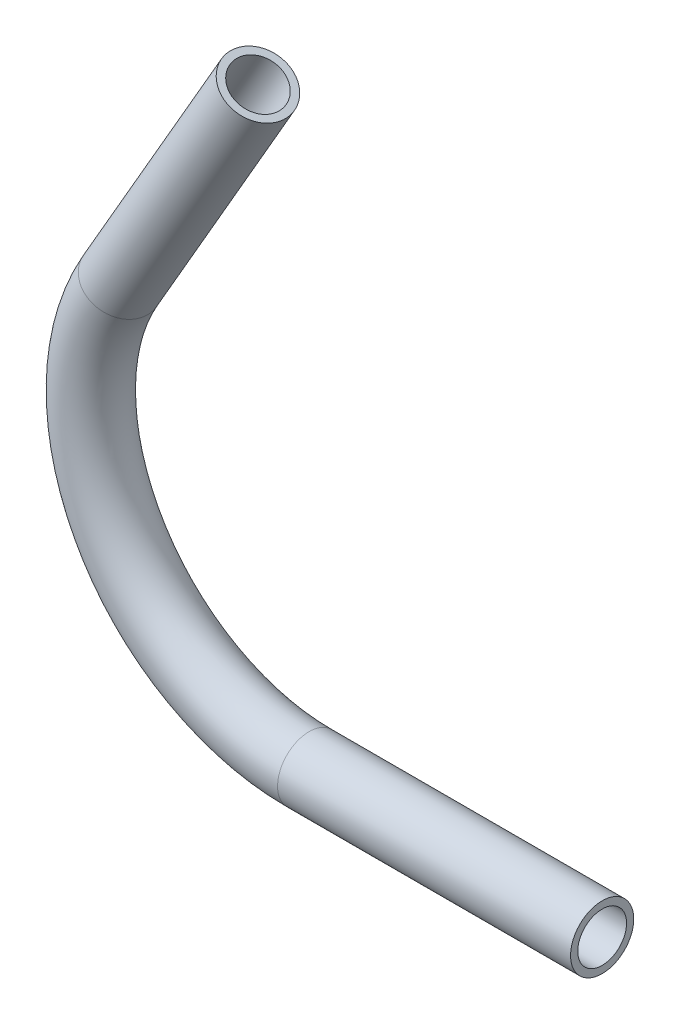
ISO-10303-21;
HEADER;
FILE_DESCRIPTION(('STEP AP214'),'2;1');
FILE_NAME('part.step','',(''),(''),'','','');
FILE_SCHEMA(('AUTOMOTIVE_DESIGN { 1 0 10303 214 1 1 1 1 }'));
ENDSEC;
DATA;
#1=APPLICATION_CONTEXT('core data for automotive mechanical design processes');
#2=APPLICATION_PROTOCOL_DEFINITION('international standard','automotive_design',2000,#1);
#3=PRODUCT_CONTEXT('',#1,'mechanical');
#4=PRODUCT('Part','Part','',(#3));
#5=PRODUCT_RELATED_PRODUCT_CATEGORY('part','',(#4));
#6=PRODUCT_DEFINITION_FORMATION('','',#4);
#7=PRODUCT_DEFINITION_CONTEXT('part definition',#1,'design');
#8=PRODUCT_DEFINITION('design','',#6,#7);
#9=PRODUCT_DEFINITION_SHAPE('','',#8);
#10=(LENGTH_UNIT() NAMED_UNIT(*) SI_UNIT(.MILLI.,.METRE.));
#11=(NAMED_UNIT(*) PLANE_ANGLE_UNIT() SI_UNIT($,.RADIAN.));
#12=(NAMED_UNIT(*) SI_UNIT($,.STERADIAN.) SOLID_ANGLE_UNIT());
#13=UNCERTAINTY_MEASURE_WITH_UNIT(LENGTH_MEASURE(1.E-05),#10,'distance_accuracy_value','');
#14=(GEOMETRIC_REPRESENTATION_CONTEXT(3) GLOBAL_UNCERTAINTY_ASSIGNED_CONTEXT((#13)) GLOBAL_UNIT_ASSIGNED_CONTEXT((#10,
#11,#12)) REPRESENTATION_CONTEXT('',''));
#15=CARTESIAN_POINT('',(0.,0.,0.));
#16=DIRECTION('',(0.,0.,1.));
#17=DIRECTION('',(1.,0.,0.));
#18=AXIS2_PLACEMENT_3D('',#15,#16,#17);
#19=CARTESIAN_POINT('',(0.,0.,0.));
#20=DIRECTION('',(0.,0.,1.));
#21=DIRECTION('',(1.,0.,0.));
#22=AXIS2_PLACEMENT_3D('',#19,#20,#21);
#23=TOROIDAL_SURFACE('',#22,76.,8.5);
#24=CARTESIAN_POINT('',(-65.8179306876176,37.9999999999996,0.));
#25=DIRECTION('',(-0.499999999999995,-0.866025403784442,0.));
#26=DIRECTION('',(0.,0.,-1.));
#27=AXIS2_PLACEMENT_3D('',#24,#25,#26);
#28=CIRCLE('',#27,8.5);
#29=CARTESIAN_POINT('',(-73.1791466197853,42.2499999999995,0.));
#30=VERTEX_POINT('',#29);
#31=EDGE_CURVE('E36',#30,#30,#28,.T.);
#32=CARTESIAN_POINT('',(0.,-76.,1.38777878078145E-13));
#33=DIRECTION('',(1.,0.,0.));
#34=DIRECTION('',(0.,0.,-1.));
#35=AXIS2_PLACEMENT_3D('',#32,#33,#34);
#36=CIRCLE('',#35,8.5);
#37=CARTESIAN_POINT('',(0.,-84.5,1.54299088126358E-13));
#38=VERTEX_POINT('',#37);
#39=EDGE_CURVE('E44',#38,#38,#36,.T.);
#40=CARTESIAN_POINT('',(0.,0.,0.));
#41=DIRECTION('',(0.,0.,1.));
#42=DIRECTION('',(1.,0.,0.));
#43=AXIS2_PLACEMENT_3D('',#40,#41,#42);
#44=CIRCLE('',#43,84.5);
#45=EDGE_CURVE('',#30,#38,#44,.T.);
#46=ORIENTED_EDGE('',*,*,#31,.F.);
#47=ORIENTED_EDGE('',*,*,#39,.T.);
#48=ORIENTED_EDGE('',*,*,#45,.T.);
#49=ORIENTED_EDGE('',*,*,#45,.F.);
#50=EDGE_LOOP('',(#46,#48,#47,#49));
#51=FACE_BOUND('',#50,.T.);
#52=ADVANCED_FACE('F29',(#51),#23,.F.);
#53=CARTESIAN_POINT('',(0.,0.,0.));
#54=DIRECTION('',(0.,0.,1.));
#55=DIRECTION('',(1.,0.,0.));
#56=AXIS2_PLACEMENT_3D('',#53,#54,#55);
#57=TOROIDAL_SURFACE('',#56,76.,11.);
#58=CARTESIAN_POINT('',(-65.8179306876176,37.9999999999996,0.));
#59=DIRECTION('',(-0.499999999999995,-0.866025403784442,0.));
#60=DIRECTION('',(0.,0.,-1.));
#61=AXIS2_PLACEMENT_3D('',#58,#59,#60);
#62=CIRCLE('',#61,11.);
#63=CARTESIAN_POINT('',(-75.3442101292464,43.4999999999995,0.));
#64=VERTEX_POINT('',#63);
#65=EDGE_CURVE('E10',#64,#64,#62,.T.);
#66=CARTESIAN_POINT('',(0.,-76.,1.38777878078145E-13));
#67=DIRECTION('',(1.,0.,0.));
#68=DIRECTION('',(0.,0.,-1.));
#69=AXIS2_PLACEMENT_3D('',#66,#67,#68);
#70=CIRCLE('',#69,11.);
#71=CARTESIAN_POINT('',(0.,-87.,1.58864149905244E-13));
#72=VERTEX_POINT('',#71);
#73=EDGE_CURVE('E40',#72,#72,#70,.T.);
#74=CARTESIAN_POINT('',(0.,0.,0.));
#75=DIRECTION('',(0.,0.,1.));
#76=DIRECTION('',(1.,0.,0.));
#77=AXIS2_PLACEMENT_3D('',#74,#75,#76);
#78=CIRCLE('',#77,87.);
#79=EDGE_CURVE('',#64,#72,#78,.T.);
#80=ORIENTED_EDGE('',*,*,#65,.T.);
#81=ORIENTED_EDGE('',*,*,#73,.F.);
#82=ORIENTED_EDGE('',*,*,#79,.T.);
#83=ORIENTED_EDGE('',*,*,#79,.F.);
#84=EDGE_LOOP('',(#80,#82,#81,#83));
#85=FACE_BOUND('',#84,.T.);
#86=ADVANCED_FACE('F31',(#85),#57,.T.);
#87=CARTESIAN_POINT('',(102.,-75.9999999999999,1.38777878078145E-13));
#88=DIRECTION('',(1.,0.,0.));
#89=DIRECTION('',(0.,0.,-1.));
#90=AXIS2_PLACEMENT_3D('',#87,#88,#89);
#91=PLANE('',#90);
#92=CARTESIAN_POINT('',(102.,-75.9999999999999,1.38777878078145E-13));
#93=DIRECTION('',(1.,0.,0.));
#94=DIRECTION('',(0.,0.,-1.));
#95=AXIS2_PLACEMENT_3D('',#92,#93,#94);
#96=CIRCLE('',#95,11.);
#97=CARTESIAN_POINT('',(102.,-75.9999999999999,-10.9999999999999));
#98=VERTEX_POINT('',#97);
#99=EDGE_CURVE('E49',#98,#98,#96,.T.);
#100=ORIENTED_EDGE('',*,*,#99,.T.);
#101=EDGE_LOOP('',(#100));
#102=FACE_BOUND('',#101,.T.);
#103=CARTESIAN_POINT('',(102.,-75.9999999999999,1.38777878078145E-13));
#104=DIRECTION('',(1.,0.,0.));
#105=DIRECTION('',(0.,0.,-1.));
#106=AXIS2_PLACEMENT_3D('',#103,#104,#105);
#107=CIRCLE('',#106,8.49999999999999);
#108=CARTESIAN_POINT('',(102.,-75.9999999999999,-8.49999999999985));
#109=VERTEX_POINT('',#108);
#110=EDGE_CURVE('E52',#109,#109,#107,.T.);
#111=ORIENTED_EDGE('',*,*,#110,.F.);
#112=EDGE_LOOP('',(#111));
#113=FACE_BOUND('',#112,.T.);
#114=ADVANCED_FACE('F85',(#102,#113),#91,.T.);
#115=CARTESIAN_POINT('',(102.,-75.9999999999999,1.38777878078145E-13));
#116=DIRECTION('',(-1.,0.,0.));
#117=DIRECTION('',(0.,0.,1.));
#118=AXIS2_PLACEMENT_3D('',#115,#116,#117);
#119=CYLINDRICAL_SURFACE('',#118,11.);
#120=ORIENTED_EDGE('',*,*,#99,.F.);
#121=EDGE_LOOP('',(#120));
#122=FACE_BOUND('',#121,.T.);
#123=ORIENTED_EDGE('',*,*,#73,.T.);
#124=EDGE_LOOP('',(#123));
#125=FACE_BOUND('',#124,.T.);
#126=ADVANCED_FACE('F76',(#122,#125),#119,.T.);
#127=CARTESIAN_POINT('',(102.,-75.9999999999999,1.38777878078145E-13));
#128=DIRECTION('',(-1.,0.,0.));
#129=DIRECTION('',(0.,0.,1.));
#130=AXIS2_PLACEMENT_3D('',#127,#128,#129);
#131=CYLINDRICAL_SURFACE('',#130,8.49999999999999);
#132=ORIENTED_EDGE('',*,*,#110,.T.);
#133=EDGE_LOOP('',(#132));
#134=FACE_BOUND('',#133,.T.);
#135=ORIENTED_EDGE('',*,*,#39,.F.);
#136=EDGE_LOOP('',(#135));
#137=FACE_BOUND('',#136,.T.);
#138=ADVANCED_FACE('F67',(#134,#137),#131,.F.);
#139=CARTESIAN_POINT('',(-17.817930687618,121.138438763306,-2.77555756156289E-13));
#140=DIRECTION('',(0.499999999999995,0.866025403784442,0.));
#141=DIRECTION('',(-0.866025403784442,0.499999999999995,0.));
#142=AXIS2_PLACEMENT_3D('',#139,#140,#141);
#143=PLANE('',#142);
#144=CARTESIAN_POINT('',(-17.817930687618,121.138438763306,-2.77555756156289E-13));
#145=DIRECTION('',(0.499999999999995,0.866025403784442,0.));
#146=DIRECTION('',(-0.866025403784442,0.499999999999995,0.));
#147=AXIS2_PLACEMENT_3D('',#144,#145,#146);
#148=CIRCLE('',#147,11.);
#149=CARTESIAN_POINT('',(-27.3442101292469,126.638438763306,-2.92400137082434E-13));
#150=VERTEX_POINT('',#149);
#151=EDGE_CURVE('E55',#150,#150,#148,.T.);
#152=ORIENTED_EDGE('',*,*,#151,.T.);
#153=EDGE_LOOP('',(#152));
#154=FACE_BOUND('',#153,.T.);
#155=CARTESIAN_POINT('',(-17.817930687618,121.138438763306,-2.77555756156289E-13));
#156=DIRECTION('',(0.499999999999995,0.866025403784442,0.));
#157=DIRECTION('',(-0.866025403784442,0.499999999999995,0.));
#158=AXIS2_PLACEMENT_3D('',#155,#156,#157);
#159=CIRCLE('',#158,8.49999999999999);
#160=CARTESIAN_POINT('',(-25.1791466197858,125.388438763306,-2.89026414144674E-13));
#161=VERTEX_POINT('',#160);
#162=EDGE_CURVE('E58',#161,#161,#159,.T.);
#163=ORIENTED_EDGE('',*,*,#162,.F.);
#164=EDGE_LOOP('',(#163));
#165=FACE_BOUND('',#164,.T.);
#166=ADVANCED_FACE('F64',(#154,#165),#143,.T.);
#167=CARTESIAN_POINT('',(-17.817930687618,121.138438763306,-2.77555756156289E-13));
#168=DIRECTION('',(-0.499999999999995,-0.866025403784442,0.));
#169=DIRECTION('',(0.866025403784442,-0.499999999999995,0.));
#170=AXIS2_PLACEMENT_3D('',#167,#168,#169);
#171=CYLINDRICAL_SURFACE('',#170,11.);
#172=ORIENTED_EDGE('',*,*,#151,.F.);
#173=EDGE_LOOP('',(#172));
#174=FACE_BOUND('',#173,.T.);
#175=ORIENTED_EDGE('',*,*,#65,.F.);
#176=EDGE_LOOP('',(#175));
#177=FACE_BOUND('',#176,.T.);
#178=ADVANCED_FACE('F66',(#174,#177),#171,.T.);
#179=CARTESIAN_POINT('',(-17.817930687618,121.138438763306,-2.77555756156289E-13));
#180=DIRECTION('',(-0.499999999999995,-0.866025403784442,0.));
#181=DIRECTION('',(0.866025403784442,-0.499999999999995,0.));
#182=AXIS2_PLACEMENT_3D('',#179,#180,#181);
#183=CYLINDRICAL_SURFACE('',#182,8.49999999999999);
#184=ORIENTED_EDGE('',*,*,#162,.T.);
#185=EDGE_LOOP('',(#184));
#186=FACE_BOUND('',#185,.T.);
#187=ORIENTED_EDGE('',*,*,#31,.T.);
#188=EDGE_LOOP('',(#187));
#189=FACE_BOUND('',#188,.T.);
#190=ADVANCED_FACE('F62',(#186,#189),#183,.F.);
#191=CLOSED_SHELL('',(#52,#86,#114,#126,#138,#166,#178,#190));
#192=MANIFOLD_SOLID_BREP('B2',#191);
#193=ADVANCED_BREP_SHAPE_REPRESENTATION('',(#18,#192),#14);
#194=SHAPE_DEFINITION_REPRESENTATION(#9,#193);
ENDSEC;
END-ISO-10303-21;
